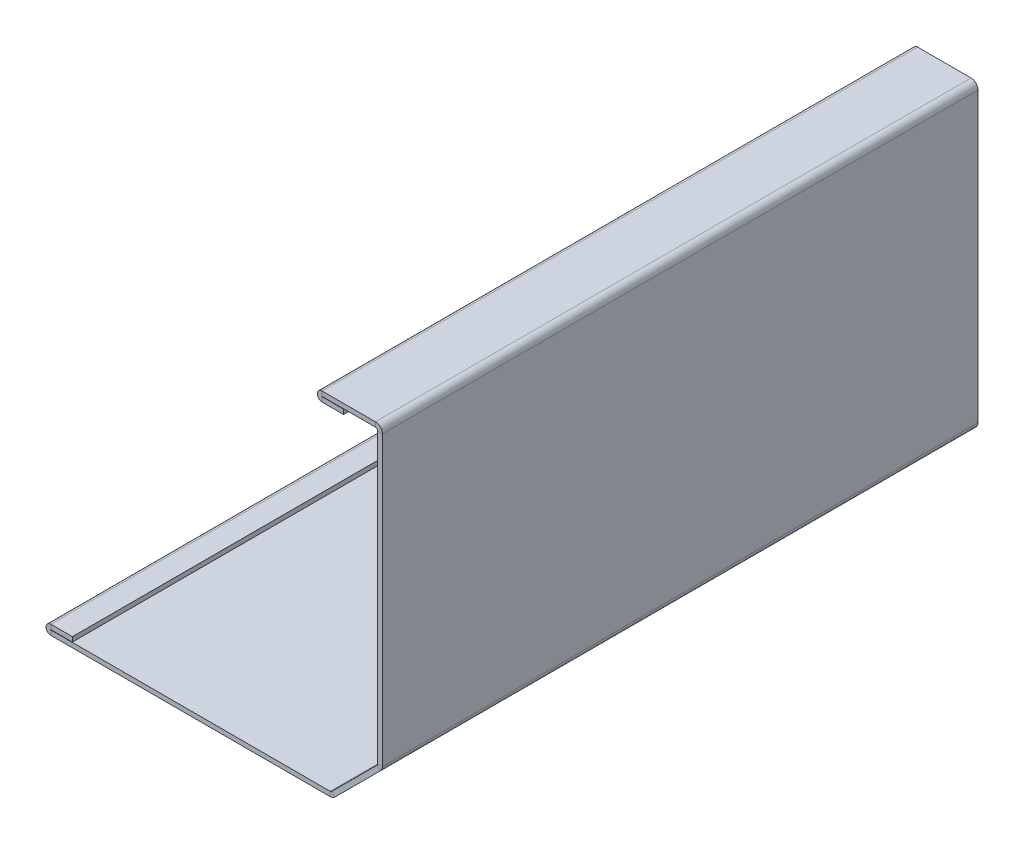
ISO-10303-21;
HEADER;
FILE_DESCRIPTION(('STEP AP214'),'2;1');
FILE_NAME('part.step','',(''),(''),'','','');
FILE_SCHEMA(('AUTOMOTIVE_DESIGN { 1 0 10303 214 1 1 1 1 }'));
ENDSEC;
DATA;
#1=APPLICATION_CONTEXT('core data for automotive mechanical design processes');
#2=APPLICATION_PROTOCOL_DEFINITION('international standard','automotive_design',2000,#1);
#3=PRODUCT_CONTEXT('',#1,'mechanical');
#4=PRODUCT('Part','Part','',(#3));
#5=PRODUCT_RELATED_PRODUCT_CATEGORY('part','',(#4));
#6=PRODUCT_DEFINITION_FORMATION('','',#4);
#7=PRODUCT_DEFINITION_CONTEXT('part definition',#1,'design');
#8=PRODUCT_DEFINITION('design','',#6,#7);
#9=PRODUCT_DEFINITION_SHAPE('','',#8);
#10=(LENGTH_UNIT() NAMED_UNIT(*) SI_UNIT(.MILLI.,.METRE.));
#11=(NAMED_UNIT(*) PLANE_ANGLE_UNIT() SI_UNIT($,.RADIAN.));
#12=(NAMED_UNIT(*) SI_UNIT($,.STERADIAN.) SOLID_ANGLE_UNIT());
#13=UNCERTAINTY_MEASURE_WITH_UNIT(LENGTH_MEASURE(1.E-05),#10,'distance_accuracy_value','');
#14=(GEOMETRIC_REPRESENTATION_CONTEXT(3) GLOBAL_UNCERTAINTY_ASSIGNED_CONTEXT((#13)) GLOBAL_UNIT_ASSIGNED_CONTEXT((#10,
#11,#12)) REPRESENTATION_CONTEXT('',''));
#15=CARTESIAN_POINT('',(0.,0.,0.));
#16=DIRECTION('',(0.,0.,1.));
#17=DIRECTION('',(1.,0.,0.));
#18=AXIS2_PLACEMENT_3D('',#15,#16,#17);
#19=CARTESIAN_POINT('',(-47.,-1.5,96.));
#20=DIRECTION('',(0.,0.,1.));
#21=DIRECTION('',(1.,0.,0.));
#22=AXIS2_PLACEMENT_3D('',#19,#20,#21);
#23=PLANE('',#22);
#24=DIRECTION('',(1.,0.,0.));
#25=VECTOR('',#24,1.);
#26=CARTESIAN_POINT('',(-47.,0.,96.));
#27=LINE('',#26,#25);
#28=CARTESIAN_POINT('',(-45.45,0.,96.));
#29=VERTEX_POINT('',#28);
#30=CARTESIAN_POINT('',(44.5735699463963,0.,96.));
#31=VERTEX_POINT('',#30);
#32=EDGE_CURVE('E103',#29,#31,#27,.T.);
#33=ORIENTED_EDGE('',*,*,#32,.F.);
#34=DIRECTION('',(0.,-1.,0.));
#35=VECTOR('',#34,1.);
#36=CARTESIAN_POINT('',(-45.45,0.,96.));
#37=LINE('',#36,#35);
#38=CARTESIAN_POINT('',(-45.45,-1.5,96.));
#39=VERTEX_POINT('',#38);
#40=EDGE_CURVE('E276',#29,#39,#37,.T.);
#41=ORIENTED_EDGE('',*,*,#40,.T.);
#42=DIRECTION('',(1.,0.,0.));
#43=VECTOR('',#42,1.);
#44=CARTESIAN_POINT('',(-47.,-1.5,96.));
#45=LINE('',#44,#43);
#46=CARTESIAN_POINT('',(44.5735699463963,-1.5,96.));
#47=VERTEX_POINT('',#46);
#48=EDGE_CURVE('E13',#39,#47,#45,.T.);
#49=ORIENTED_EDGE('',*,*,#48,.T.);
#50=DIRECTION('',(0.,-1.,0.));
#51=VECTOR('',#50,1.);
#52=CARTESIAN_POINT('',(44.5735699463963,0.,96.));
#53=LINE('',#52,#51);
#54=EDGE_CURVE('E300',#31,#47,#53,.T.);
#55=ORIENTED_EDGE('',*,*,#54,.F.);
#56=EDGE_LOOP('',(#33,#41,#49,#55));
#57=FACE_BOUND('',#56,.T.);
#58=ADVANCED_FACE('F99',(#57),#23,.T.);
#59=CARTESIAN_POINT('',(61.4393398282213,110.43933982822,-96.));
#60=DIRECTION('',(0.,0.,1.));
#61=DIRECTION('',(1.,0.,0.));
#62=AXIS2_PLACEMENT_3D('',#59,#60,#61);
#63=PLANE('',#62);
#64=DIRECTION('',(1.,0.,0.));
#65=VECTOR('',#64,1.);
#66=CARTESIAN_POINT('',(59.9393398282213,108.20273982822,-96.));
#67=LINE('',#66,#65);
#68=CARTESIAN_POINT('',(59.9393398282213,108.20273982822,-96.));
#69=VERTEX_POINT('',#68);
#70=CARTESIAN_POINT('',(61.4393398282213,108.20273982822,-96.));
#71=VERTEX_POINT('',#70);
#72=EDGE_CURVE('E390',#69,#71,#67,.T.);
#73=ORIENTED_EDGE('',*,*,#72,.T.);
#74=DIRECTION('',(0.,1.,0.));
#75=VECTOR('',#74,1.);
#76=CARTESIAN_POINT('',(61.4393398282201,-1.50000000000069,-96.));
#77=LINE('',#76,#75);
#78=CARTESIAN_POINT('',(61.4393398282203,15.3657698818238,-96.));
#79=VERTEX_POINT('',#78);
#80=EDGE_CURVE('E387',#79,#71,#77,.T.);
#81=ORIENTED_EDGE('',*,*,#80,.F.);
#82=DIRECTION('',(-1.,0.,0.));
#83=VECTOR('',#82,1.);
#84=CARTESIAN_POINT('',(59.9393398282202,15.3657698818238,-96.));
#85=LINE('',#84,#83);
#86=CARTESIAN_POINT('',(59.9393398282202,15.3657698818238,-96.));
#87=VERTEX_POINT('',#86);
#88=EDGE_CURVE('E376',#87,#79,#85,.F.);
#89=ORIENTED_EDGE('',*,*,#88,.F.);
#90=DIRECTION('',(0.,-1.,0.));
#91=VECTOR('',#90,1.);
#92=CARTESIAN_POINT('',(59.9393398282213,110.43933982822,-96.));
#93=LINE('',#92,#91);
#94=EDGE_CURVE('E382',#87,#69,#93,.F.);
#95=ORIENTED_EDGE('',*,*,#94,.T.);
#96=EDGE_LOOP('',(#73,#81,#89,#95));
#97=FACE_BOUND('',#96,.T.);
#98=ADVANCED_FACE('F619',(#97),#63,.F.);
#99=CARTESIAN_POINT('',(61.4393398282203,15.0606601717797,96.));
#100=DIRECTION('',(0.,0.,-1.));
#101=DIRECTION('',(-1.,0.,0.));
#102=AXIS2_PLACEMENT_3D('',#99,#100,#101);
#103=PLANE('',#102);
#104=DIRECTION('',(1.,0.,0.));
#105=VECTOR('',#104,1.);
#106=CARTESIAN_POINT('',(59.9393398282213,108.20273982822,96.));
#107=LINE('',#106,#105);
#108=CARTESIAN_POINT('',(59.9393398282213,108.20273982822,96.));
#109=VERTEX_POINT('',#108);
#110=CARTESIAN_POINT('',(61.4393398282213,108.20273982822,96.));
#111=VERTEX_POINT('',#110);
#112=EDGE_CURVE('E374',#109,#111,#107,.T.);
#113=ORIENTED_EDGE('',*,*,#112,.F.);
#114=DIRECTION('',(0.,1.,0.));
#115=VECTOR('',#114,1.);
#116=CARTESIAN_POINT('',(59.9393398282202,15.0606601717797,96.));
#117=LINE('',#116,#115);
#118=CARTESIAN_POINT('',(59.9393398282202,15.3657698818238,95.9999999999999));
#119=VERTEX_POINT('',#118);
#120=EDGE_CURVE('E385',#109,#119,#117,.F.);
#121=ORIENTED_EDGE('',*,*,#120,.T.);
#122=DIRECTION('',(-1.,0.,0.));
#123=VECTOR('',#122,1.);
#124=CARTESIAN_POINT('',(61.4393398282203,15.3657698818238,96.));
#125=LINE('',#124,#123);
#126=CARTESIAN_POINT('',(61.4393398282203,15.3657698818238,95.9999999999999));
#127=VERTEX_POINT('',#126);
#128=EDGE_CURVE('E370',#119,#127,#125,.F.);
#129=ORIENTED_EDGE('',*,*,#128,.T.);
#130=DIRECTION('',(0.,-1.,0.));
#131=VECTOR('',#130,1.);
#132=CARTESIAN_POINT('',(61.4393398282201,-1.50000000000069,96.));
#133=LINE('',#132,#131);
#134=EDGE_CURVE('E357',#111,#127,#133,.T.);
#135=ORIENTED_EDGE('',*,*,#134,.F.);
#136=EDGE_LOOP('',(#113,#121,#129,#135));
#137=FACE_BOUND('',#136,.T.);
#138=ADVANCED_FACE('F553',(#137),#103,.F.);
#139=CARTESIAN_POINT('',(61.4393398282201,-1.50000000000069,0.));
#140=DIRECTION('',(-1.,0.,0.));
#141=DIRECTION('',(0.,-1.,0.));
#142=AXIS2_PLACEMENT_3D('',#139,#140,#141);
#143=PLANE('',#142);
#144=DIRECTION('',(0.,0.,-1.));
#145=VECTOR('',#144,1.);
#146=CARTESIAN_POINT('',(61.4393398282213,108.20273982822,-96.));
#147=LINE('',#146,#145);
#148=EDGE_CURVE('E409',#71,#111,#147,.F.);
#149=ORIENTED_EDGE('',*,*,#148,.T.);
#150=ORIENTED_EDGE('',*,*,#134,.T.);
#151=DIRECTION('',(0.,0.,-1.));
#152=VECTOR('',#151,1.);
#153=CARTESIAN_POINT('',(61.4393398282203,15.3657698818238,96.));
#154=LINE('',#153,#152);
#155=EDGE_CURVE('E379',#79,#127,#154,.F.);
#156=ORIENTED_EDGE('',*,*,#155,.F.);
#157=ORIENTED_EDGE('',*,*,#80,.T.);
#158=EDGE_LOOP('',(#149,#150,#156,#157));
#159=FACE_BOUND('',#158,.T.);
#160=ADVANCED_FACE('F668',(#159),#143,.F.);
#161=CARTESIAN_POINT('',(59.9393398282201,-1.50000000000067,0.));
#162=DIRECTION('',(-1.,0.,0.));
#163=DIRECTION('',(0.,-1.,0.));
#164=AXIS2_PLACEMENT_3D('',#161,#162,#163);
#165=PLANE('',#164);
#166=ORIENTED_EDGE('',*,*,#120,.F.);
#167=DIRECTION('',(0.,0.,-1.));
#168=VECTOR('',#167,1.);
#169=CARTESIAN_POINT('',(59.9393398282213,108.20273982822,-96.));
#170=LINE('',#169,#168);
#171=EDGE_CURVE('E399',#69,#109,#170,.F.);
#172=ORIENTED_EDGE('',*,*,#171,.F.);
#173=ORIENTED_EDGE('',*,*,#94,.F.);
#174=DIRECTION('',(0.,0.,-1.));
#175=VECTOR('',#174,1.);
#176=CARTESIAN_POINT('',(59.9393398282202,15.3657698818238,96.));
#177=LINE('',#176,#175);
#178=EDGE_CURVE('E373',#119,#87,#177,.T.);
#179=ORIENTED_EDGE('',*,*,#178,.F.);
#180=EDGE_LOOP('',(#166,#172,#173,#179));
#181=FACE_BOUND('',#180,.T.);
#182=ADVANCED_FACE('F556',(#181),#165,.T.);
#183=CARTESIAN_POINT('',(45.9393398282202,-1.06066017177983,96.));
#184=DIRECTION('',(0.,0.,-1.));
#185=DIRECTION('',(-1.,0.,0.));
#186=AXIS2_PLACEMENT_3D('',#183,#184,#185);
#187=PLANE('',#186);
#188=DIRECTION('',(0.707106781186544,-0.707106781186551,0.));
#189=VECTOR('',#188,1.);
#190=CARTESIAN_POINT('',(59.7235946832423,14.8449150268018,95.9999999999999));
#191=LINE('',#190,#189);
#192=CARTESIAN_POINT('',(59.7235946832423,14.8449150268018,95.9999999999999));
#193=VERTEX_POINT('',#192);
#194=CARTESIAN_POINT('',(60.7842548550221,13.7842548550219,95.9999999999999));
#195=VERTEX_POINT('',#194);
#196=EDGE_CURVE('E331',#193,#195,#191,.T.);
#197=ORIENTED_EDGE('',*,*,#196,.F.);
#198=DIRECTION('',(0.707106781186551,0.707106781186544,0.));
#199=VECTOR('',#198,1.);
#200=CARTESIAN_POINT('',(44.8786796564403,0.,96.));
#201=LINE('',#200,#199);
#202=CARTESIAN_POINT('',(45.0944248014183,0.215745144977973,96.));
#203=VERTEX_POINT('',#202);
#204=EDGE_CURVE('E339',#193,#203,#201,.F.);
#205=ORIENTED_EDGE('',*,*,#204,.T.);
#206=DIRECTION('',(-0.707106781186544,0.707106781186551,0.));
#207=VECTOR('',#206,1.);
#208=CARTESIAN_POINT('',(46.1550849731981,-0.84491502680185,96.));
#209=LINE('',#208,#207);
#210=CARTESIAN_POINT('',(46.1550849731981,-0.844915026801848,96.));
#211=VERTEX_POINT('',#210);
#212=EDGE_CURVE('E327',#203,#211,#209,.F.);
#213=ORIENTED_EDGE('',*,*,#212,.T.);
#214=DIRECTION('',(-0.707106781186551,-0.707106781186544,0.));
#215=VECTOR('',#214,1.);
#216=CARTESIAN_POINT('',(22.4393398282199,-24.5606601717798,96.));
#217=LINE('',#216,#215);
#218=EDGE_CURVE('E344',#195,#211,#217,.T.);
#219=ORIENTED_EDGE('',*,*,#218,.F.);
#220=EDGE_LOOP('',(#197,#205,#213,#219));
#221=FACE_BOUND('',#220,.T.);
#222=ADVANCED_FACE('F537',(#221),#187,.F.);
#223=CARTESIAN_POINT('',(62.5000000000001,15.4999999999999,-96.));
#224=DIRECTION('',(0.,0.,1.));
#225=DIRECTION('',(1.,0.,0.));
#226=AXIS2_PLACEMENT_3D('',#223,#224,#225);
#227=PLANE('',#226);
#228=DIRECTION('',(0.707106781186544,-0.707106781186551,0.));
#229=VECTOR('',#228,1.);
#230=CARTESIAN_POINT('',(59.7235946832423,14.8449150268018,-96.));
#231=LINE('',#230,#229);
#232=CARTESIAN_POINT('',(59.7235946832423,14.8449150268018,-96.));
#233=VERTEX_POINT('',#232);
#234=CARTESIAN_POINT('',(60.7842548550221,13.7842548550219,-96.));
#235=VERTEX_POINT('',#234);
#236=EDGE_CURVE('E347',#233,#235,#231,.T.);
#237=ORIENTED_EDGE('',*,*,#236,.T.);
#238=DIRECTION('',(0.707106781186551,0.707106781186544,0.));
#239=VECTOR('',#238,1.);
#240=CARTESIAN_POINT('',(22.4393398282199,-24.5606601717798,-96.));
#241=LINE('',#240,#239);
#242=CARTESIAN_POINT('',(46.1550849731981,-0.844915026801867,-96.));
#243=VERTEX_POINT('',#242);
#244=EDGE_CURVE('E315',#243,#235,#241,.T.);
#245=ORIENTED_EDGE('',*,*,#244,.F.);
#246=DIRECTION('',(-0.707106781186544,0.707106781186551,0.));
#247=VECTOR('',#246,1.);
#248=CARTESIAN_POINT('',(45.0944248014183,0.215745144977963,-96.));
#249=LINE('',#248,#247);
#250=CARTESIAN_POINT('',(45.0944248014183,0.215745144977947,-96.));
#251=VERTEX_POINT('',#250);
#252=EDGE_CURVE('E333',#251,#243,#249,.F.);
#253=ORIENTED_EDGE('',*,*,#252,.F.);
#254=DIRECTION('',(-0.707106781186551,-0.707106781186544,0.));
#255=VECTOR('',#254,1.);
#256=CARTESIAN_POINT('',(61.4393398282203,16.5606601717797,-96.));
#257=LINE('',#256,#255);
#258=EDGE_CURVE('E341',#251,#233,#257,.F.);
#259=ORIENTED_EDGE('',*,*,#258,.T.);
#260=EDGE_LOOP('',(#237,#245,#253,#259));
#261=FACE_BOUND('',#260,.T.);
#262=ADVANCED_FACE('F644',(#261),#227,.F.);
#263=CARTESIAN_POINT('',(22.4393398282199,-24.5606601717798,0.));
#264=DIRECTION('',(-0.707106781186544,0.707106781186551,0.));
#265=DIRECTION('',(-0.707106781186551,-0.707106781186544,0.));
#266=AXIS2_PLACEMENT_3D('',#263,#264,#265);
#267=PLANE('',#266);
#268=DIRECTION('',(0.,0.,-1.));
#269=VECTOR('',#268,1.);
#270=CARTESIAN_POINT('',(60.7842548550221,13.7842548550219,-96.));
#271=LINE('',#270,#269);
#272=EDGE_CURVE('E366',#235,#195,#271,.F.);
#273=ORIENTED_EDGE('',*,*,#272,.T.);
#274=ORIENTED_EDGE('',*,*,#218,.T.);
#275=DIRECTION('',(0.,0.,-1.));
#276=VECTOR('',#275,1.);
#277=CARTESIAN_POINT('',(46.1550849731981,-0.844915026801853,96.));
#278=LINE('',#277,#276);
#279=EDGE_CURVE('E336',#243,#211,#278,.F.);
#280=ORIENTED_EDGE('',*,*,#279,.F.);
#281=ORIENTED_EDGE('',*,*,#244,.T.);
#282=EDGE_LOOP('',(#273,#274,#280,#281));
#283=FACE_BOUND('',#282,.T.);
#284=ADVANCED_FACE('F647',(#283),#267,.F.);
#285=CARTESIAN_POINT('',(21.3786796564401,-23.5,0.));
#286=DIRECTION('',(-0.707106781186544,0.707106781186551,0.));
#287=DIRECTION('',(-0.707106781186551,-0.707106781186544,0.));
#288=AXIS2_PLACEMENT_3D('',#285,#286,#287);
#289=PLANE('',#288);
#290=ORIENTED_EDGE('',*,*,#204,.F.);
#291=DIRECTION('',(0.,0.,-1.));
#292=VECTOR('',#291,1.);
#293=CARTESIAN_POINT('',(59.7235946832423,14.8449150268018,-96.));
#294=LINE('',#293,#292);
#295=EDGE_CURVE('E356',#233,#193,#294,.F.);
#296=ORIENTED_EDGE('',*,*,#295,.F.);
#297=ORIENTED_EDGE('',*,*,#258,.F.);
#298=DIRECTION('',(0.,0.,-1.));
#299=VECTOR('',#298,1.);
#300=CARTESIAN_POINT('',(45.0944248014183,0.215745144977977,96.));
#301=LINE('',#300,#299);
#302=EDGE_CURVE('E330',#203,#251,#301,.T.);
#303=ORIENTED_EDGE('',*,*,#302,.F.);
#304=EDGE_LOOP('',(#290,#296,#297,#303));
#305=FACE_BOUND('',#304,.T.);
#306=ADVANCED_FACE('F540',(#305),#289,.T.);
#307=CARTESIAN_POINT('',(-47.,-1.5,-96.));
#308=DIRECTION('',(0.,0.,-1.));
#309=DIRECTION('',(-1.,0.,0.));
#310=AXIS2_PLACEMENT_3D('',#307,#308,#309);
#311=PLANE('',#310);
#312=DIRECTION('',(0.,-1.,0.));
#313=VECTOR('',#312,1.);
#314=CARTESIAN_POINT('',(-45.45,0.,-96.));
#315=LINE('',#314,#313);
#316=CARTESIAN_POINT('',(-45.45,0.,-96.));
#317=VERTEX_POINT('',#316);
#318=CARTESIAN_POINT('',(-45.45,-1.5,-96.));
#319=VERTEX_POINT('',#318);
#320=EDGE_CURVE('E264',#317,#319,#315,.T.);
#321=ORIENTED_EDGE('',*,*,#320,.F.);
#322=DIRECTION('',(-1.,0.,0.));
#323=VECTOR('',#322,1.);
#324=CARTESIAN_POINT('',(-47.,0.,-96.));
#325=LINE('',#324,#323);
#326=CARTESIAN_POINT('',(44.5735699463963,0.,-96.));
#327=VERTEX_POINT('',#326);
#328=EDGE_CURVE('E297',#327,#317,#325,.T.);
#329=ORIENTED_EDGE('',*,*,#328,.F.);
#330=DIRECTION('',(0.,-1.,0.));
#331=VECTOR('',#330,1.);
#332=CARTESIAN_POINT('',(44.5735699463963,0.,-96.));
#333=LINE('',#332,#331);
#334=CARTESIAN_POINT('',(44.5735699463963,-1.50000000000004,-96.));
#335=VERTEX_POINT('',#334);
#336=EDGE_CURVE('E295',#327,#335,#333,.T.);
#337=ORIENTED_EDGE('',*,*,#336,.T.);
#338=DIRECTION('',(-1.,0.,0.));
#339=VECTOR('',#338,1.);
#340=CARTESIAN_POINT('',(-47.,-1.5,-96.));
#341=LINE('',#340,#339);
#342=EDGE_CURVE('E108',#335,#319,#341,.T.);
#343=ORIENTED_EDGE('',*,*,#342,.T.);
#344=EDGE_LOOP('',(#321,#329,#337,#343));
#345=FACE_BOUND('',#344,.T.);
#346=ADVANCED_FACE('F101',(#345),#311,.T.);
#347=CARTESIAN_POINT('',(0.,-1.5,0.));
#348=DIRECTION('',(0.,-1.,0.));
#349=DIRECTION('',(0.,0.,-1.));
#350=AXIS2_PLACEMENT_3D('',#347,#348,#349);
#351=PLANE('',#350);
#352=DIRECTION('',(0.,0.,1.));
#353=VECTOR('',#352,1.);
#354=CARTESIAN_POINT('',(-45.45,-1.5,96.));
#355=LINE('',#354,#353);
#356=EDGE_CURVE('E283',#39,#319,#355,.F.);
#357=ORIENTED_EDGE('',*,*,#356,.T.);
#358=ORIENTED_EDGE('',*,*,#342,.F.);
#359=DIRECTION('',(0.,0.,-1.));
#360=VECTOR('',#359,1.);
#361=CARTESIAN_POINT('',(44.5735699463963,-1.50000000000004,-96.));
#362=LINE('',#361,#360);
#363=EDGE_CURVE('E324',#335,#47,#362,.F.);
#364=ORIENTED_EDGE('',*,*,#363,.T.);
#365=ORIENTED_EDGE('',*,*,#48,.F.);
#366=EDGE_LOOP('',(#357,#358,#364,#365));
#367=FACE_BOUND('',#366,.T.);
#368=ADVANCED_FACE('F290',(#367),#351,.T.);
#369=CARTESIAN_POINT('',(0.,0.,0.));
#370=DIRECTION('',(0.,-1.,0.));
#371=DIRECTION('',(0.,0.,-1.));
#372=AXIS2_PLACEMENT_3D('',#369,#370,#371);
#373=PLANE('',#372);
#374=ORIENTED_EDGE('',*,*,#328,.T.);
#375=DIRECTION('',(0.,0.,1.));
#376=VECTOR('',#375,1.);
#377=CARTESIAN_POINT('',(-45.45,0.,96.));
#378=LINE('',#377,#376);
#379=EDGE_CURVE('E518',#29,#317,#378,.F.);
#380=ORIENTED_EDGE('',*,*,#379,.F.);
#381=ORIENTED_EDGE('',*,*,#32,.T.);
#382=DIRECTION('',(0.,0.,-1.));
#383=VECTOR('',#382,1.);
#384=CARTESIAN_POINT('',(44.5735699463963,0.,-96.));
#385=LINE('',#384,#383);
#386=EDGE_CURVE('E314',#327,#31,#385,.F.);
#387=ORIENTED_EDGE('',*,*,#386,.F.);
#388=EDGE_LOOP('',(#374,#380,#381,#387));
#389=FACE_BOUND('',#388,.T.);
#390=ADVANCED_FACE('F528',(#389),#373,.F.);
#391=CARTESIAN_POINT('',(44.5735699463963,0.736599999999988,96.));
#392=DIRECTION('',(0.,0.,1.));
#393=DIRECTION('',(0.,-1.,0.));
#394=AXIS2_PLACEMENT_3D('',#391,#392,#393);
#395=PLANE('',#394);
#396=ORIENTED_EDGE('',*,*,#212,.F.);
#397=CARTESIAN_POINT('',(44.5735699463963,0.736599999999988,96.));
#398=DIRECTION('',(0.,0.,-1.));
#399=DIRECTION('',(0.,1.,0.));
#400=AXIS2_PLACEMENT_3D('',#397,#398,#399);
#401=CIRCLE('',#400,0.736600000000002);
#402=EDGE_CURVE('E318',#31,#203,#401,.F.);
#403=ORIENTED_EDGE('',*,*,#402,.F.);
#404=ORIENTED_EDGE('',*,*,#54,.T.);
#405=CARTESIAN_POINT('',(44.5735699463963,0.736599999999988,96.));
#406=DIRECTION('',(0.,0.,-1.));
#407=DIRECTION('',(0.,1.,0.));
#408=AXIS2_PLACEMENT_3D('',#405,#406,#407);
#409=CIRCLE('',#408,2.2366);
#410=EDGE_CURVE('E309',#47,#211,#409,.F.);
#411=ORIENTED_EDGE('',*,*,#410,.T.);
#412=EDGE_LOOP('',(#396,#403,#404,#411));
#413=FACE_BOUND('',#412,.T.);
#414=ADVANCED_FACE('F534',(#413),#395,.T.);
#415=CARTESIAN_POINT('',(44.5735699463963,0.736599999999962,-96.));
#416=DIRECTION('',(0.,0.,1.));
#417=DIRECTION('',(0.,-1.,0.));
#418=AXIS2_PLACEMENT_3D('',#415,#416,#417);
#419=PLANE('',#418);
#420=CARTESIAN_POINT('',(44.5735699463963,0.736599999999962,-96.));
#421=DIRECTION('',(0.,0.,-1.));
#422=DIRECTION('',(0.,1.,0.));
#423=AXIS2_PLACEMENT_3D('',#420,#421,#422);
#424=CIRCLE('',#423,0.736600000000002);
#425=EDGE_CURVE('E311',#251,#327,#424,.T.);
#426=ORIENTED_EDGE('',*,*,#425,.F.);
#427=ORIENTED_EDGE('',*,*,#252,.T.);
#428=CARTESIAN_POINT('',(44.5735699463963,0.736599999999962,-96.));
#429=DIRECTION('',(0.,0.,-1.));
#430=DIRECTION('',(0.,1.,0.));
#431=AXIS2_PLACEMENT_3D('',#428,#429,#430);
#432=CIRCLE('',#431,2.2366);
#433=EDGE_CURVE('E321',#243,#335,#432,.T.);
#434=ORIENTED_EDGE('',*,*,#433,.T.);
#435=ORIENTED_EDGE('',*,*,#336,.F.);
#436=EDGE_LOOP('',(#426,#427,#434,#435));
#437=FACE_BOUND('',#436,.T.);
#438=ADVANCED_FACE('F630',(#437),#419,.F.);
#439=CARTESIAN_POINT('',(44.5735699463963,0.736599999999962,-96.));
#440=DIRECTION('',(0.,0.,-1.));
#441=DIRECTION('',(0.707106781186544,-0.707106781186551,0.));
#442=AXIS2_PLACEMENT_3D('',#439,#440,#441);
#443=CYLINDRICAL_SURFACE('',#442,2.2366);
#444=ORIENTED_EDGE('',*,*,#363,.F.);
#445=ORIENTED_EDGE('',*,*,#433,.F.);
#446=ORIENTED_EDGE('',*,*,#279,.T.);
#447=ORIENTED_EDGE('',*,*,#410,.F.);
#448=EDGE_LOOP('',(#444,#445,#446,#447));
#449=FACE_BOUND('',#448,.T.);
#450=ADVANCED_FACE('F633',(#449),#443,.T.);
#451=CARTESIAN_POINT('',(44.5735699463963,0.736599999999962,-96.));
#452=DIRECTION('',(0.,0.,-1.));
#453=DIRECTION('',(0.707106781186544,-0.707106781186551,0.));
#454=AXIS2_PLACEMENT_3D('',#451,#452,#453);
#455=CYLINDRICAL_SURFACE('',#454,0.736600000000002);
#456=ORIENTED_EDGE('',*,*,#386,.T.);
#457=ORIENTED_EDGE('',*,*,#402,.T.);
#458=ORIENTED_EDGE('',*,*,#302,.T.);
#459=ORIENTED_EDGE('',*,*,#425,.T.);
#460=EDGE_LOOP('',(#456,#457,#458,#459));
#461=FACE_BOUND('',#460,.T.);
#462=ADVANCED_FACE('F530',(#461),#455,.F.);
#463=CARTESIAN_POINT('',(59.2027398282203,15.3657698818238,95.9999999999999));
#464=DIRECTION('',(0.,0.,1.));
#465=DIRECTION('',(1.,0.,0.));
#466=AXIS2_PLACEMENT_3D('',#463,#464,#465);
#467=PLANE('',#466);
#468=ORIENTED_EDGE('',*,*,#128,.F.);
#469=CARTESIAN_POINT('',(59.2027398282203,15.3657698818238,95.9999999999999));
#470=DIRECTION('',(0.,0.,-1.));
#471=DIRECTION('',(-1.,0.,0.));
#472=AXIS2_PLACEMENT_3D('',#469,#470,#471);
#473=CIRCLE('',#472,0.736599999999997);
#474=EDGE_CURVE('E360',#193,#119,#473,.F.);
#475=ORIENTED_EDGE('',*,*,#474,.F.);
#476=ORIENTED_EDGE('',*,*,#196,.T.);
#477=CARTESIAN_POINT('',(59.2027398282203,15.3657698818238,95.9999999999999));
#478=DIRECTION('',(0.,0.,-1.));
#479=DIRECTION('',(-1.,0.,0.));
#480=AXIS2_PLACEMENT_3D('',#477,#478,#479);
#481=CIRCLE('',#480,2.2366);
#482=EDGE_CURVE('E350',#195,#127,#481,.F.);
#483=ORIENTED_EDGE('',*,*,#482,.T.);
#484=EDGE_LOOP('',(#468,#475,#476,#483));
#485=FACE_BOUND('',#484,.T.);
#486=ADVANCED_FACE('F549',(#485),#467,.T.);
#487=CARTESIAN_POINT('',(59.2027398282203,15.3657698818238,-96.));
#488=DIRECTION('',(0.,0.,1.));
#489=DIRECTION('',(1.,0.,0.));
#490=AXIS2_PLACEMENT_3D('',#487,#488,#489);
#491=PLANE('',#490);
#492=CARTESIAN_POINT('',(59.2027398282203,15.3657698818238,-96.));
#493=DIRECTION('',(0.,0.,-1.));
#494=DIRECTION('',(-1.,0.,0.));
#495=AXIS2_PLACEMENT_3D('',#492,#493,#494);
#496=CIRCLE('',#495,0.736599999999997);
#497=EDGE_CURVE('E353',#87,#233,#496,.T.);
#498=ORIENTED_EDGE('',*,*,#497,.F.);
#499=ORIENTED_EDGE('',*,*,#88,.T.);
#500=CARTESIAN_POINT('',(59.2027398282203,15.3657698818238,-96.));
#501=DIRECTION('',(0.,0.,-1.));
#502=DIRECTION('',(-1.,0.,0.));
#503=AXIS2_PLACEMENT_3D('',#500,#501,#502);
#504=CIRCLE('',#503,2.2366);
#505=EDGE_CURVE('E363',#79,#235,#504,.T.);
#506=ORIENTED_EDGE('',*,*,#505,.T.);
#507=ORIENTED_EDGE('',*,*,#236,.F.);
#508=EDGE_LOOP('',(#498,#499,#506,#507));
#509=FACE_BOUND('',#508,.T.);
#510=ADVANCED_FACE('F654',(#509),#491,.F.);
#511=CARTESIAN_POINT('',(59.2027398282203,15.3657698818238,-96.));
#512=DIRECTION('',(0.,0.,-1.));
#513=DIRECTION('',(1.,0.,0.));
#514=AXIS2_PLACEMENT_3D('',#511,#512,#513);
#515=CYLINDRICAL_SURFACE('',#514,2.2366);
#516=ORIENTED_EDGE('',*,*,#272,.F.);
#517=ORIENTED_EDGE('',*,*,#505,.F.);
#518=ORIENTED_EDGE('',*,*,#155,.T.);
#519=ORIENTED_EDGE('',*,*,#482,.F.);
#520=EDGE_LOOP('',(#516,#517,#518,#519));
#521=FACE_BOUND('',#520,.T.);
#522=ADVANCED_FACE('F657',(#521),#515,.T.);
#523=CARTESIAN_POINT('',(59.2027398282203,15.3657698818238,-96.));
#524=DIRECTION('',(0.,0.,-1.));
#525=DIRECTION('',(1.,0.,0.));
#526=AXIS2_PLACEMENT_3D('',#523,#524,#525);
#527=CYLINDRICAL_SURFACE('',#526,0.736599999999997);
#528=ORIENTED_EDGE('',*,*,#295,.T.);
#529=ORIENTED_EDGE('',*,*,#474,.T.);
#530=ORIENTED_EDGE('',*,*,#178,.T.);
#531=ORIENTED_EDGE('',*,*,#497,.T.);
#532=EDGE_LOOP('',(#528,#529,#530,#531));
#533=FACE_BOUND('',#532,.T.);
#534=ADVANCED_FACE('F544',(#533),#527,.F.);
#535=CARTESIAN_POINT('',(59.2027398282213,108.20273982822,96.));
#536=DIRECTION('',(0.,0.,1.));
#537=DIRECTION('',(1.,0.,0.));
#538=AXIS2_PLACEMENT_3D('',#535,#536,#537);
#539=PLANE('',#538);
#540=DIRECTION('',(0.,-1.,0.));
#541=VECTOR('',#540,1.);
#542=CARTESIAN_POINT('',(59.2027398282213,110.43933982822,96.));
#543=LINE('',#542,#541);
#544=CARTESIAN_POINT('',(59.2027398282213,108.93933982822,96.));
#545=VERTEX_POINT('',#544);
#546=CARTESIAN_POINT('',(59.2027398282213,110.43933982822,96.));
#547=VERTEX_POINT('',#546);
#548=EDGE_CURVE('E413',#545,#547,#543,.F.);
#549=ORIENTED_EDGE('',*,*,#548,.F.);
#550=CARTESIAN_POINT('',(59.2027398282213,108.20273982822,96.));
#551=DIRECTION('',(0.,0.,-1.));
#552=DIRECTION('',(-1.,0.,0.));
#553=AXIS2_PLACEMENT_3D('',#550,#551,#552);
#554=CIRCLE('',#553,0.73659999999999);
#555=EDGE_CURVE('E403',#109,#545,#554,.F.);
#556=ORIENTED_EDGE('',*,*,#555,.F.);
#557=ORIENTED_EDGE('',*,*,#112,.T.);
#558=CARTESIAN_POINT('',(59.2027398282213,108.20273982822,96.));
#559=DIRECTION('',(0.,0.,-1.));
#560=DIRECTION('',(-1.,0.,0.));
#561=AXIS2_PLACEMENT_3D('',#558,#559,#560);
#562=CIRCLE('',#561,2.23659999999999);
#563=EDGE_CURVE('E393',#111,#547,#562,.F.);
#564=ORIENTED_EDGE('',*,*,#563,.T.);
#565=EDGE_LOOP('',(#549,#556,#557,#564));
#566=FACE_BOUND('',#565,.T.);
#567=ADVANCED_FACE('F565',(#566),#539,.T.);
#568=CARTESIAN_POINT('',(59.2027398282213,108.20273982822,-96.));
#569=DIRECTION('',(0.,0.,1.));
#570=DIRECTION('',(1.,0.,0.));
#571=AXIS2_PLACEMENT_3D('',#568,#569,#570);
#572=PLANE('',#571);
#573=CARTESIAN_POINT('',(59.2027398282213,108.20273982822,-96.));
#574=DIRECTION('',(0.,0.,-1.));
#575=DIRECTION('',(-1.,0.,0.));
#576=AXIS2_PLACEMENT_3D('',#573,#574,#575);
#577=CIRCLE('',#576,0.73659999999999);
#578=CARTESIAN_POINT('',(59.2027398282213,108.93933982822,-96.));
#579=VERTEX_POINT('',#578);
#580=EDGE_CURVE('E396',#579,#69,#577,.T.);
#581=ORIENTED_EDGE('',*,*,#580,.F.);
#582=DIRECTION('',(0.,-1.,0.));
#583=VECTOR('',#582,1.);
#584=CARTESIAN_POINT('',(59.2027398282213,108.93933982822,-96.));
#585=LINE('',#584,#583);
#586=CARTESIAN_POINT('',(59.2027398282213,110.43933982822,-96.));
#587=VERTEX_POINT('',#586);
#588=EDGE_CURVE('E419',#579,#587,#585,.F.);
#589=ORIENTED_EDGE('',*,*,#588,.T.);
#590=CARTESIAN_POINT('',(59.2027398282213,108.20273982822,-96.));
#591=DIRECTION('',(0.,0.,-1.));
#592=DIRECTION('',(-1.,0.,0.));
#593=AXIS2_PLACEMENT_3D('',#590,#591,#592);
#594=CIRCLE('',#593,2.23659999999999);
#595=EDGE_CURVE('E406',#587,#71,#594,.T.);
#596=ORIENTED_EDGE('',*,*,#595,.T.);
#597=ORIENTED_EDGE('',*,*,#72,.F.);
#598=EDGE_LOOP('',(#581,#589,#596,#597));
#599=FACE_BOUND('',#598,.T.);
#600=ADVANCED_FACE('F574',(#599),#572,.F.);
#601=CARTESIAN_POINT('',(59.2027398282213,108.20273982822,-96.));
#602=DIRECTION('',(0.,0.,-1.));
#603=DIRECTION('',(0.,1.,0.));
#604=AXIS2_PLACEMENT_3D('',#601,#602,#603);
#605=CYLINDRICAL_SURFACE('',#604,2.23659999999999);
#606=ORIENTED_EDGE('',*,*,#148,.F.);
#607=ORIENTED_EDGE('',*,*,#595,.F.);
#608=DIRECTION('',(0.,0.,-1.));
#609=VECTOR('',#608,1.);
#610=CARTESIAN_POINT('',(59.2027398282213,110.43933982822,96.));
#611=LINE('',#610,#609);
#612=EDGE_CURVE('E422',#587,#547,#611,.F.);
#613=ORIENTED_EDGE('',*,*,#612,.T.);
#614=ORIENTED_EDGE('',*,*,#563,.F.);
#615=EDGE_LOOP('',(#606,#607,#613,#614));
#616=FACE_BOUND('',#615,.T.);
#617=ADVANCED_FACE('F676',(#616),#605,.T.);
#618=CARTESIAN_POINT('',(59.2027398282213,108.20273982822,-96.));
#619=DIRECTION('',(0.,0.,-1.));
#620=DIRECTION('',(0.,1.,0.));
#621=AXIS2_PLACEMENT_3D('',#618,#619,#620);
#622=CYLINDRICAL_SURFACE('',#621,0.73659999999999);
#623=ORIENTED_EDGE('',*,*,#171,.T.);
#624=ORIENTED_EDGE('',*,*,#555,.T.);
#625=DIRECTION('',(0.,0.,-1.));
#626=VECTOR('',#625,1.);
#627=CARTESIAN_POINT('',(59.2027398282213,108.93933982822,96.));
#628=LINE('',#627,#626);
#629=EDGE_CURVE('E416',#545,#579,#628,.T.);
#630=ORIENTED_EDGE('',*,*,#629,.T.);
#631=ORIENTED_EDGE('',*,*,#580,.T.);
#632=EDGE_LOOP('',(#623,#624,#630,#631));
#633=FACE_BOUND('',#632,.T.);
#634=ADVANCED_FACE('F560',(#633),#622,.F.);
#635=CARTESIAN_POINT('',(40.4393398282213,110.43933982822,-96.));
#636=DIRECTION('',(0.,0.,1.));
#637=DIRECTION('',(1.,0.,0.));
#638=AXIS2_PLACEMENT_3D('',#635,#636,#637);
#639=PLANE('',#638);
#640=DIRECTION('',(1.,0.,0.));
#641=VECTOR('',#640,1.);
#642=CARTESIAN_POINT('',(40.4393398282213,108.93933982822,-96.));
#643=LINE('',#642,#641);
#644=CARTESIAN_POINT('',(41.9893398282213,108.93933982822,-96.));
#645=VERTEX_POINT('',#644);
#646=EDGE_CURVE('E425',#579,#645,#643,.F.);
#647=ORIENTED_EDGE('',*,*,#646,.T.);
#648=DIRECTION('',(0.,1.,0.));
#649=VECTOR('',#648,1.);
#650=CARTESIAN_POINT('',(41.9893398282213,108.93933982822,-96.));
#651=LINE('',#650,#649);
#652=CARTESIAN_POINT('',(41.9893398282213,110.43933982822,-96.));
#653=VERTEX_POINT('',#652);
#654=EDGE_CURVE('E116',#645,#653,#651,.T.);
#655=ORIENTED_EDGE('',*,*,#654,.T.);
#656=DIRECTION('',(-1.,0.,0.));
#657=VECTOR('',#656,1.);
#658=CARTESIAN_POINT('',(1.57718975920946E-12,110.439339828221,-96.));
#659=LINE('',#658,#657);
#660=EDGE_CURVE('E429',#587,#653,#659,.T.);
#661=ORIENTED_EDGE('',*,*,#660,.F.);
#662=ORIENTED_EDGE('',*,*,#588,.F.);
#663=EDGE_LOOP('',(#647,#655,#661,#662));
#664=FACE_BOUND('',#663,.T.);
#665=ADVANCED_FACE('F576',(#664),#639,.F.);
#666=CARTESIAN_POINT('',(59.9393398282213,110.43933982822,96.));
#667=DIRECTION('',(0.,0.,-1.));
#668=DIRECTION('',(-1.,0.,0.));
#669=AXIS2_PLACEMENT_3D('',#666,#667,#668);
#670=PLANE('',#669);
#671=DIRECTION('',(1.,0.,0.));
#672=VECTOR('',#671,1.);
#673=CARTESIAN_POINT('',(1.57718975920946E-12,110.439339828221,96.));
#674=LINE('',#673,#672);
#675=CARTESIAN_POINT('',(41.9893398282213,110.43933982822,96.));
#676=VERTEX_POINT('',#675);
#677=EDGE_CURVE('E400',#676,#547,#674,.T.);
#678=ORIENTED_EDGE('',*,*,#677,.F.);
#679=DIRECTION('',(0.,1.,0.));
#680=VECTOR('',#679,1.);
#681=CARTESIAN_POINT('',(41.9893398282213,108.93933982822,96.));
#682=LINE('',#681,#680);
#683=CARTESIAN_POINT('',(41.9893398282213,108.93933982822,96.));
#684=VERTEX_POINT('',#683);
#685=EDGE_CURVE('E446',#684,#676,#682,.T.);
#686=ORIENTED_EDGE('',*,*,#685,.F.);
#687=DIRECTION('',(-1.,0.,0.));
#688=VECTOR('',#687,1.);
#689=CARTESIAN_POINT('',(59.9393398282213,108.93933982822,96.));
#690=LINE('',#689,#688);
#691=EDGE_CURVE('E427',#684,#545,#690,.F.);
#692=ORIENTED_EDGE('',*,*,#691,.T.);
#693=ORIENTED_EDGE('',*,*,#548,.T.);
#694=EDGE_LOOP('',(#678,#686,#692,#693));
#695=FACE_BOUND('',#694,.T.);
#696=ADVANCED_FACE('F568',(#695),#670,.F.);
#697=CARTESIAN_POINT('',(1.57718975920946E-12,110.439339828221,0.));
#698=DIRECTION('',(0.,-1.,0.));
#699=DIRECTION('',(1.,0.,0.));
#700=AXIS2_PLACEMENT_3D('',#697,#698,#699);
#701=PLANE('',#700);
#702=ORIENTED_EDGE('',*,*,#660,.T.);
#703=DIRECTION('',(0.,0.,-1.));
#704=VECTOR('',#703,1.);
#705=CARTESIAN_POINT('',(41.9893398282213,110.43933982822,-96.));
#706=LINE('',#705,#704);
#707=EDGE_CURVE('E480',#653,#676,#706,.F.);
#708=ORIENTED_EDGE('',*,*,#707,.T.);
#709=ORIENTED_EDGE('',*,*,#677,.T.);
#710=ORIENTED_EDGE('',*,*,#612,.F.);
#711=EDGE_LOOP('',(#702,#708,#709,#710));
#712=FACE_BOUND('',#711,.T.);
#713=ADVANCED_FACE('F579',(#712),#701,.F.);
#714=CARTESIAN_POINT('',(1.55558356319146E-12,108.939339828221,0.));
#715=DIRECTION('',(0.,-1.,0.));
#716=DIRECTION('',(1.,0.,0.));
#717=AXIS2_PLACEMENT_3D('',#714,#715,#716);
#718=PLANE('',#717);
#719=DIRECTION('',(0.,0.,-1.));
#720=VECTOR('',#719,1.);
#721=CARTESIAN_POINT('',(41.9893398282213,108.93933982822,-96.));
#722=LINE('',#721,#720);
#723=EDGE_CURVE('E124',#645,#684,#722,.F.);
#724=ORIENTED_EDGE('',*,*,#723,.F.);
#725=ORIENTED_EDGE('',*,*,#646,.F.);
#726=ORIENTED_EDGE('',*,*,#629,.F.);
#727=ORIENTED_EDGE('',*,*,#691,.F.);
#728=EDGE_LOOP('',(#724,#725,#726,#727));
#729=FACE_BOUND('',#728,.T.);
#730=ADVANCED_FACE('F570',(#729),#718,.T.);
#731=CARTESIAN_POINT('',(45.4643398282213,107.33933982822,-96.));
#732=DIRECTION('',(0.,0.,1.));
#733=DIRECTION('',(-1.,0.,0.));
#734=AXIS2_PLACEMENT_3D('',#731,#732,#733);
#735=PLANE('',#734);
#736=DIRECTION('',(0.,-1.,0.));
#737=VECTOR('',#736,1.);
#738=CARTESIAN_POINT('',(41.9893398282213,107.33933982822,-96.));
#739=LINE('',#738,#737);
#740=CARTESIAN_POINT('',(41.9893398282213,108.83933982822,-96.));
#741=VERTEX_POINT('',#740);
#742=CARTESIAN_POINT('',(41.9893398282213,107.33933982822,-96.));
#743=VERTEX_POINT('',#742);
#744=EDGE_CURVE('E438',#741,#743,#739,.T.);
#745=ORIENTED_EDGE('',*,*,#744,.F.);
#746=DIRECTION('',(1.,0.,0.));
#747=VECTOR('',#746,1.);
#748=CARTESIAN_POINT('',(45.4643398282213,108.83933982822,-96.));
#749=LINE('',#748,#747);
#750=CARTESIAN_POINT('',(48.9393398282213,108.83933982822,-96.));
#751=VERTEX_POINT('',#750);
#752=EDGE_CURVE('E448',#751,#741,#749,.F.);
#753=ORIENTED_EDGE('',*,*,#752,.F.);
#754=DIRECTION('',(0.,-1.,0.));
#755=VECTOR('',#754,1.);
#756=CARTESIAN_POINT('',(48.9393398282213,107.33933982822,-96.));
#757=LINE('',#756,#755);
#758=CARTESIAN_POINT('',(48.9393398282213,107.33933982822,-96.));
#759=VERTEX_POINT('',#758);
#760=EDGE_CURVE('E434',#751,#759,#757,.T.);
#761=ORIENTED_EDGE('',*,*,#760,.T.);
#762=DIRECTION('',(-1.,0.,0.));
#763=VECTOR('',#762,1.);
#764=CARTESIAN_POINT('',(45.4643398282213,107.33933982822,-96.));
#765=LINE('',#764,#763);
#766=EDGE_CURVE('E460',#759,#743,#765,.T.);
#767=ORIENTED_EDGE('',*,*,#766,.T.);
#768=EDGE_LOOP('',(#745,#753,#761,#767));
#769=FACE_BOUND('',#768,.T.);
#770=ADVANCED_FACE('F589',(#769),#735,.F.);
#771=CARTESIAN_POINT('',(48.9393398282213,107.33933982822,0.));
#772=DIRECTION('',(-1.,0.,0.));
#773=DIRECTION('',(0.,0.,-1.));
#774=AXIS2_PLACEMENT_3D('',#771,#772,#773);
#775=PLANE('',#774);
#776=ORIENTED_EDGE('',*,*,#760,.F.);
#777=DIRECTION('',(0.,0.,1.));
#778=VECTOR('',#777,1.);
#779=CARTESIAN_POINT('',(48.9393398282213,108.83933982822,0.));
#780=LINE('',#779,#778);
#781=CARTESIAN_POINT('',(48.9393398282213,108.83933982822,96.));
#782=VERTEX_POINT('',#781);
#783=EDGE_CURVE('E451',#782,#751,#780,.F.);
#784=ORIENTED_EDGE('',*,*,#783,.F.);
#785=DIRECTION('',(0.,-1.,0.));
#786=VECTOR('',#785,1.);
#787=CARTESIAN_POINT('',(48.9393398282213,107.33933982822,96.));
#788=LINE('',#787,#786);
#789=CARTESIAN_POINT('',(48.9393398282213,107.33933982822,96.));
#790=VERTEX_POINT('',#789);
#791=EDGE_CURVE('E432',#782,#790,#788,.T.);
#792=ORIENTED_EDGE('',*,*,#791,.T.);
#793=DIRECTION('',(0.,0.,-1.));
#794=VECTOR('',#793,1.);
#795=CARTESIAN_POINT('',(48.9393398282213,107.33933982822,0.));
#796=LINE('',#795,#794);
#797=EDGE_CURVE('E435',#790,#759,#796,.T.);
#798=ORIENTED_EDGE('',*,*,#797,.T.);
#799=EDGE_LOOP('',(#776,#784,#792,#798));
#800=FACE_BOUND('',#799,.T.);
#801=ADVANCED_FACE('F608',(#800),#775,.F.);
#802=CARTESIAN_POINT('',(45.4643398282213,107.33933982822,96.));
#803=DIRECTION('',(0.,0.,-1.));
#804=DIRECTION('',(1.,0.,0.));
#805=AXIS2_PLACEMENT_3D('',#802,#803,#804);
#806=PLANE('',#805);
#807=DIRECTION('',(1.,0.,0.));
#808=VECTOR('',#807,1.);
#809=CARTESIAN_POINT('',(45.4643398282213,108.83933982822,96.));
#810=LINE('',#809,#808);
#811=CARTESIAN_POINT('',(41.9893398282213,108.83933982822,96.));
#812=VERTEX_POINT('',#811);
#813=EDGE_CURVE('E442',#812,#782,#810,.T.);
#814=ORIENTED_EDGE('',*,*,#813,.F.);
#815=DIRECTION('',(0.,-1.,0.));
#816=VECTOR('',#815,1.);
#817=CARTESIAN_POINT('',(41.9893398282213,107.33933982822,96.));
#818=LINE('',#817,#816);
#819=CARTESIAN_POINT('',(41.9893398282213,107.33933982822,96.));
#820=VERTEX_POINT('',#819);
#821=EDGE_CURVE('E417',#812,#820,#818,.T.);
#822=ORIENTED_EDGE('',*,*,#821,.T.);
#823=DIRECTION('',(1.,0.,0.));
#824=VECTOR('',#823,1.);
#825=CARTESIAN_POINT('',(45.4643398282213,107.33933982822,96.));
#826=LINE('',#825,#824);
#827=EDGE_CURVE('E454',#820,#790,#826,.T.);
#828=ORIENTED_EDGE('',*,*,#827,.T.);
#829=ORIENTED_EDGE('',*,*,#791,.F.);
#830=EDGE_LOOP('',(#814,#822,#828,#829));
#831=FACE_BOUND('',#830,.T.);
#832=ADVANCED_FACE('F603',(#831),#806,.F.);
#833=CARTESIAN_POINT('',(45.4643398282213,107.33933982822,0.));
#834=DIRECTION('',(0.,-1.,0.));
#835=DIRECTION('',(1.,0.,0.));
#836=AXIS2_PLACEMENT_3D('',#833,#834,#835);
#837=PLANE('',#836);
#838=ORIENTED_EDGE('',*,*,#797,.F.);
#839=ORIENTED_EDGE('',*,*,#827,.F.);
#840=DIRECTION('',(0.,0.,1.));
#841=VECTOR('',#840,1.);
#842=CARTESIAN_POINT('',(41.9893398282213,107.33933982822,0.));
#843=LINE('',#842,#841);
#844=EDGE_CURVE('E457',#743,#820,#843,.T.);
#845=ORIENTED_EDGE('',*,*,#844,.F.);
#846=ORIENTED_EDGE('',*,*,#766,.F.);
#847=EDGE_LOOP('',(#838,#839,#845,#846));
#848=FACE_BOUND('',#847,.T.);
#849=ADVANCED_FACE('F606',(#848),#837,.T.);
#850=CARTESIAN_POINT('',(45.4643398282213,108.83933982822,0.));
#851=DIRECTION('',(0.,-1.,0.));
#852=DIRECTION('',(1.,0.,0.));
#853=AXIS2_PLACEMENT_3D('',#850,#851,#852);
#854=PLANE('',#853);
#855=ORIENTED_EDGE('',*,*,#783,.T.);
#856=ORIENTED_EDGE('',*,*,#752,.T.);
#857=DIRECTION('',(0.,0.,1.));
#858=VECTOR('',#857,1.);
#859=CARTESIAN_POINT('',(41.9893398282213,108.83933982822,0.));
#860=LINE('',#859,#858);
#861=EDGE_CURVE('E445',#741,#812,#860,.T.);
#862=ORIENTED_EDGE('',*,*,#861,.T.);
#863=ORIENTED_EDGE('',*,*,#813,.T.);
#864=EDGE_LOOP('',(#855,#856,#862,#863));
#865=FACE_BOUND('',#864,.T.);
#866=ADVANCED_FACE('F593',(#865),#854,.F.);
#867=CARTESIAN_POINT('',(41.9893398282213,108.88933982822,96.));
#868=DIRECTION('',(0.,0.,1.));
#869=DIRECTION('',(1.,0.,0.));
#870=AXIS2_PLACEMENT_3D('',#867,#868,#869);
#871=PLANE('',#870);
#872=ORIENTED_EDGE('',*,*,#821,.F.);
#873=CARTESIAN_POINT('',(41.9893398282213,108.88933982822,96.));
#874=DIRECTION('',(0.,0.,-1.));
#875=DIRECTION('',(-1.,0.,0.));
#876=AXIS2_PLACEMENT_3D('',#873,#874,#875);
#877=CIRCLE('',#876,0.0500000000000084);
#878=EDGE_CURVE('E474',#684,#812,#877,.F.);
#879=ORIENTED_EDGE('',*,*,#878,.F.);
#880=ORIENTED_EDGE('',*,*,#685,.T.);
#881=CARTESIAN_POINT('',(41.9893398282213,108.88933982822,96.));
#882=DIRECTION('',(0.,0.,-1.));
#883=DIRECTION('',(-1.,0.,0.));
#884=AXIS2_PLACEMENT_3D('',#881,#882,#883);
#885=CIRCLE('',#884,1.55000000000001);
#886=EDGE_CURVE('E466',#676,#820,#885,.F.);
#887=ORIENTED_EDGE('',*,*,#886,.T.);
#888=EDGE_LOOP('',(#872,#879,#880,#887));
#889=FACE_BOUND('',#888,.T.);
#890=ADVANCED_FACE('F601',(#889),#871,.T.);
#891=CARTESIAN_POINT('',(41.9893398282213,108.88933982822,-96.));
#892=DIRECTION('',(0.,0.,1.));
#893=DIRECTION('',(1.,0.,0.));
#894=AXIS2_PLACEMENT_3D('',#891,#892,#893);
#895=PLANE('',#894);
#896=CARTESIAN_POINT('',(41.9893398282213,108.88933982822,-96.));
#897=DIRECTION('',(0.,0.,-1.));
#898=DIRECTION('',(-1.,0.,0.));
#899=AXIS2_PLACEMENT_3D('',#896,#897,#898);
#900=CIRCLE('',#899,0.0500000000000084);
#901=EDGE_CURVE('E469',#741,#645,#900,.T.);
#902=ORIENTED_EDGE('',*,*,#901,.F.);
#903=ORIENTED_EDGE('',*,*,#744,.T.);
#904=CARTESIAN_POINT('',(41.9893398282213,108.88933982822,-96.));
#905=DIRECTION('',(0.,0.,-1.));
#906=DIRECTION('',(-1.,0.,0.));
#907=AXIS2_PLACEMENT_3D('',#904,#905,#906);
#908=CIRCLE('',#907,1.55000000000001);
#909=EDGE_CURVE('E477',#743,#653,#908,.T.);
#910=ORIENTED_EDGE('',*,*,#909,.T.);
#911=ORIENTED_EDGE('',*,*,#654,.F.);
#912=EDGE_LOOP('',(#902,#903,#910,#911));
#913=FACE_BOUND('',#912,.T.);
#914=ADVANCED_FACE('F586',(#913),#895,.F.);
#915=CARTESIAN_POINT('',(41.9893398282213,108.88933982822,-96.));
#916=DIRECTION('',(0.,0.,-1.));
#917=DIRECTION('',(0.,-1.,0.));
#918=AXIS2_PLACEMENT_3D('',#915,#916,#917);
#919=CYLINDRICAL_SURFACE('',#918,1.55000000000001);
#920=ORIENTED_EDGE('',*,*,#707,.F.);
#921=ORIENTED_EDGE('',*,*,#909,.F.);
#922=ORIENTED_EDGE('',*,*,#844,.T.);
#923=ORIENTED_EDGE('',*,*,#886,.F.);
#924=EDGE_LOOP('',(#920,#921,#922,#923));
#925=FACE_BOUND('',#924,.T.);
#926=ADVANCED_FACE('F583',(#925),#919,.T.);
#927=CARTESIAN_POINT('',(41.9893398282213,108.88933982822,-96.));
#928=DIRECTION('',(0.,0.,-1.));
#929=DIRECTION('',(0.,-1.,0.));
#930=AXIS2_PLACEMENT_3D('',#927,#928,#929);
#931=CYLINDRICAL_SURFACE('',#930,0.0500000000000084);
#932=ORIENTED_EDGE('',*,*,#723,.T.);
#933=ORIENTED_EDGE('',*,*,#878,.T.);
#934=ORIENTED_EDGE('',*,*,#861,.F.);
#935=ORIENTED_EDGE('',*,*,#901,.T.);
#936=EDGE_LOOP('',(#932,#933,#934,#935));
#937=FACE_BOUND('',#936,.T.);
#938=ADVANCED_FACE('F597',(#937),#931,.F.);
#939=CARTESIAN_POINT('',(-41.975,1.6,96.));
#940=DIRECTION('',(0.,0.,-1.));
#941=DIRECTION('',(-1.,0.,0.));
#942=AXIS2_PLACEMENT_3D('',#939,#940,#941);
#943=PLANE('',#942);
#944=DIRECTION('',(0.,1.,0.));
#945=VECTOR('',#944,1.);
#946=CARTESIAN_POINT('',(-45.45,1.6,96.));
#947=LINE('',#946,#945);
#948=CARTESIAN_POINT('',(-45.45,0.1,96.));
#949=VERTEX_POINT('',#948);
#950=CARTESIAN_POINT('',(-45.45,1.6,96.));
#951=VERTEX_POINT('',#950);
#952=EDGE_CURVE('E491',#949,#951,#947,.T.);
#953=ORIENTED_EDGE('',*,*,#952,.F.);
#954=DIRECTION('',(1.,0.,0.));
#955=VECTOR('',#954,1.);
#956=CARTESIAN_POINT('',(-41.975,0.1,96.));
#957=LINE('',#956,#955);
#958=CARTESIAN_POINT('',(-38.5,0.1,96.));
#959=VERTEX_POINT('',#958);
#960=EDGE_CURVE('E499',#959,#949,#957,.F.);
#961=ORIENTED_EDGE('',*,*,#960,.F.);
#962=DIRECTION('',(0.,1.,0.));
#963=VECTOR('',#962,1.);
#964=CARTESIAN_POINT('',(-38.5,1.6,96.));
#965=LINE('',#964,#963);
#966=CARTESIAN_POINT('',(-38.5,1.6,96.));
#967=VERTEX_POINT('',#966);
#968=EDGE_CURVE('E487',#959,#967,#965,.T.);
#969=ORIENTED_EDGE('',*,*,#968,.T.);
#970=DIRECTION('',(-1.,0.,0.));
#971=VECTOR('',#970,1.);
#972=CARTESIAN_POINT('',(-41.975,1.6,96.));
#973=LINE('',#972,#971);
#974=EDGE_CURVE('E509',#967,#951,#973,.T.);
#975=ORIENTED_EDGE('',*,*,#974,.T.);
#976=EDGE_LOOP('',(#953,#961,#969,#975));
#977=FACE_BOUND('',#976,.T.);
#978=ADVANCED_FACE('F770',(#977),#943,.F.);
#979=CARTESIAN_POINT('',(-38.5,1.6,0.));
#980=DIRECTION('',(-1.,0.,0.));
#981=DIRECTION('',(0.,0.,1.));
#982=AXIS2_PLACEMENT_3D('',#979,#980,#981);
#983=PLANE('',#982);
#984=ORIENTED_EDGE('',*,*,#968,.F.);
#985=DIRECTION('',(0.,0.,1.));
#986=VECTOR('',#985,1.);
#987=CARTESIAN_POINT('',(-38.5,0.1,0.));
#988=LINE('',#987,#986);
#989=CARTESIAN_POINT('',(-38.5,0.1,-96.));
#990=VERTEX_POINT('',#989);
#991=EDGE_CURVE('E502',#990,#959,#988,.T.);
#992=ORIENTED_EDGE('',*,*,#991,.F.);
#993=DIRECTION('',(0.,1.,0.));
#994=VECTOR('',#993,1.);
#995=CARTESIAN_POINT('',(-38.5,1.6,-96.));
#996=LINE('',#995,#994);
#997=CARTESIAN_POINT('',(-38.5,1.6,-96.));
#998=VERTEX_POINT('',#997);
#999=EDGE_CURVE('E485',#990,#998,#996,.T.);
#1000=ORIENTED_EDGE('',*,*,#999,.T.);
#1001=DIRECTION('',(0.,0.,1.));
#1002=VECTOR('',#1001,1.);
#1003=CARTESIAN_POINT('',(-38.5,1.6,0.));
#1004=LINE('',#1003,#1002);
#1005=EDGE_CURVE('E488',#998,#967,#1004,.T.);
#1006=ORIENTED_EDGE('',*,*,#1005,.T.);
#1007=EDGE_LOOP('',(#984,#992,#1000,#1006));
#1008=FACE_BOUND('',#1007,.T.);
#1009=ADVANCED_FACE('F780',(#1008),#983,.F.);
#1010=CARTESIAN_POINT('',(-41.975,1.6,-96.));
#1011=DIRECTION('',(0.,0.,1.));
#1012=DIRECTION('',(1.,0.,0.));
#1013=AXIS2_PLACEMENT_3D('',#1010,#1011,#1012);
#1014=PLANE('',#1013);
#1015=DIRECTION('',(1.,0.,0.));
#1016=VECTOR('',#1015,1.);
#1017=CARTESIAN_POINT('',(-41.975,0.1,-96.));
#1018=LINE('',#1017,#1016);
#1019=CARTESIAN_POINT('',(-45.45,0.1,-96.));
#1020=VERTEX_POINT('',#1019);
#1021=EDGE_CURVE('E275',#1020,#990,#1018,.T.);
#1022=ORIENTED_EDGE('',*,*,#1021,.F.);
#1023=DIRECTION('',(0.,1.,0.));
#1024=VECTOR('',#1023,1.);
#1025=CARTESIAN_POINT('',(-45.45,1.6,-96.));
#1026=LINE('',#1025,#1024);
#1027=CARTESIAN_POINT('',(-45.45,1.6,-96.));
#1028=VERTEX_POINT('',#1027);
#1029=EDGE_CURVE('E472',#1020,#1028,#1026,.T.);
#1030=ORIENTED_EDGE('',*,*,#1029,.T.);
#1031=DIRECTION('',(1.,0.,0.));
#1032=VECTOR('',#1031,1.);
#1033=CARTESIAN_POINT('',(-41.975,1.6,-96.));
#1034=LINE('',#1033,#1032);
#1035=EDGE_CURVE('E505',#1028,#998,#1034,.T.);
#1036=ORIENTED_EDGE('',*,*,#1035,.T.);
#1037=ORIENTED_EDGE('',*,*,#999,.F.);
#1038=EDGE_LOOP('',(#1022,#1030,#1036,#1037));
#1039=FACE_BOUND('',#1038,.T.);
#1040=ADVANCED_FACE('F791',(#1039),#1014,.F.);
#1041=CARTESIAN_POINT('',(-41.975,1.6,0.));
#1042=DIRECTION('',(0.,1.,0.));
#1043=DIRECTION('',(0.,0.,1.));
#1044=AXIS2_PLACEMENT_3D('',#1041,#1042,#1043);
#1045=PLANE('',#1044);
#1046=ORIENTED_EDGE('',*,*,#1005,.F.);
#1047=ORIENTED_EDGE('',*,*,#1035,.F.);
#1048=DIRECTION('',(0.,0.,-1.));
#1049=VECTOR('',#1048,1.);
#1050=CARTESIAN_POINT('',(-45.45,1.6,0.));
#1051=LINE('',#1050,#1049);
#1052=EDGE_CURVE('E285',#951,#1028,#1051,.T.);
#1053=ORIENTED_EDGE('',*,*,#1052,.F.);
#1054=ORIENTED_EDGE('',*,*,#974,.F.);
#1055=EDGE_LOOP('',(#1046,#1047,#1053,#1054));
#1056=FACE_BOUND('',#1055,.T.);
#1057=ADVANCED_FACE('F802',(#1056),#1045,.T.);
#1058=CARTESIAN_POINT('',(-41.975,0.1,0.));
#1059=DIRECTION('',(0.,1.,0.));
#1060=DIRECTION('',(0.,0.,1.));
#1061=AXIS2_PLACEMENT_3D('',#1058,#1059,#1060);
#1062=PLANE('',#1061);
#1063=ORIENTED_EDGE('',*,*,#991,.T.);
#1064=ORIENTED_EDGE('',*,*,#960,.T.);
#1065=DIRECTION('',(0.,0.,1.));
#1066=VECTOR('',#1065,1.);
#1067=CARTESIAN_POINT('',(-45.45,0.1,0.));
#1068=LINE('',#1067,#1066);
#1069=EDGE_CURVE('E497',#949,#1020,#1068,.F.);
#1070=ORIENTED_EDGE('',*,*,#1069,.T.);
#1071=ORIENTED_EDGE('',*,*,#1021,.T.);
#1072=EDGE_LOOP('',(#1063,#1064,#1070,#1071));
#1073=FACE_BOUND('',#1072,.T.);
#1074=ADVANCED_FACE('F813',(#1073),#1062,.F.);
#1075=CARTESIAN_POINT('',(-45.45,0.05,-96.));
#1076=DIRECTION('',(0.,0.,-1.));
#1077=DIRECTION('',(-1.,0.,0.));
#1078=AXIS2_PLACEMENT_3D('',#1075,#1076,#1077);
#1079=PLANE('',#1078);
#1080=ORIENTED_EDGE('',*,*,#1029,.F.);
#1081=CARTESIAN_POINT('',(-45.45,0.05,-96.));
#1082=DIRECTION('',(0.,0.,1.));
#1083=DIRECTION('',(1.,0.,0.));
#1084=AXIS2_PLACEMENT_3D('',#1081,#1082,#1083);
#1085=CIRCLE('',#1084,0.05);
#1086=EDGE_CURVE('E270',#317,#1020,#1085,.F.);
#1087=ORIENTED_EDGE('',*,*,#1086,.F.);
#1088=ORIENTED_EDGE('',*,*,#320,.T.);
#1089=CARTESIAN_POINT('',(-45.45,0.05,-96.));
#1090=DIRECTION('',(0.,0.,1.));
#1091=DIRECTION('',(1.,0.,0.));
#1092=AXIS2_PLACEMENT_3D('',#1089,#1090,#1091);
#1093=CIRCLE('',#1092,1.55);
#1094=EDGE_CURVE('E268',#319,#1028,#1093,.F.);
#1095=ORIENTED_EDGE('',*,*,#1094,.T.);
#1096=EDGE_LOOP('',(#1080,#1087,#1088,#1095));
#1097=FACE_BOUND('',#1096,.T.);
#1098=ADVANCED_FACE('F267',(#1097),#1079,.T.);
#1099=CARTESIAN_POINT('',(-45.45,0.05,96.));
#1100=DIRECTION('',(0.,0.,-1.));
#1101=DIRECTION('',(-1.,0.,0.));
#1102=AXIS2_PLACEMENT_3D('',#1099,#1100,#1101);
#1103=PLANE('',#1102);
#1104=CARTESIAN_POINT('',(-45.45,0.05,96.));
#1105=DIRECTION('',(0.,0.,1.));
#1106=DIRECTION('',(1.,0.,0.));
#1107=AXIS2_PLACEMENT_3D('',#1104,#1105,#1106);
#1108=CIRCLE('',#1107,0.05);
#1109=EDGE_CURVE('E516',#949,#29,#1108,.T.);
#1110=ORIENTED_EDGE('',*,*,#1109,.F.);
#1111=ORIENTED_EDGE('',*,*,#952,.T.);
#1112=CARTESIAN_POINT('',(-45.45,0.05,96.));
#1113=DIRECTION('',(0.,0.,1.));
#1114=DIRECTION('',(1.,0.,0.));
#1115=AXIS2_PLACEMENT_3D('',#1112,#1113,#1114);
#1116=CIRCLE('',#1115,1.55);
#1117=EDGE_CURVE('E292',#951,#39,#1116,.T.);
#1118=ORIENTED_EDGE('',*,*,#1117,.T.);
#1119=ORIENTED_EDGE('',*,*,#40,.F.);
#1120=EDGE_LOOP('',(#1110,#1111,#1118,#1119));
#1121=FACE_BOUND('',#1120,.T.);
#1122=ADVANCED_FACE('F524',(#1121),#1103,.F.);
#1123=CARTESIAN_POINT('',(-45.45,0.05,96.));
#1124=DIRECTION('',(0.,0.,1.));
#1125=DIRECTION('',(0.,1.,0.));
#1126=AXIS2_PLACEMENT_3D('',#1123,#1124,#1125);
#1127=CYLINDRICAL_SURFACE('',#1126,1.55);
#1128=ORIENTED_EDGE('',*,*,#356,.F.);
#1129=ORIENTED_EDGE('',*,*,#1117,.F.);
#1130=ORIENTED_EDGE('',*,*,#1052,.T.);
#1131=ORIENTED_EDGE('',*,*,#1094,.F.);
#1132=EDGE_LOOP('',(#1128,#1129,#1130,#1131));
#1133=FACE_BOUND('',#1132,.T.);
#1134=ADVANCED_FACE('F281',(#1133),#1127,.T.);
#1135=CARTESIAN_POINT('',(-45.45,0.05,96.));
#1136=DIRECTION('',(0.,0.,1.));
#1137=DIRECTION('',(0.,1.,0.));
#1138=AXIS2_PLACEMENT_3D('',#1135,#1136,#1137);
#1139=CYLINDRICAL_SURFACE('',#1138,0.05);
#1140=ORIENTED_EDGE('',*,*,#379,.T.);
#1141=ORIENTED_EDGE('',*,*,#1086,.T.);
#1142=ORIENTED_EDGE('',*,*,#1069,.F.);
#1143=ORIENTED_EDGE('',*,*,#1109,.T.);
#1144=EDGE_LOOP('',(#1140,#1141,#1142,#1143));
#1145=FACE_BOUND('',#1144,.T.);
#1146=ADVANCED_FACE('F852',(#1145),#1139,.F.);
#1147=CLOSED_SHELL('',(#58,#98,#138,#160,#182,#222,#262,#284,#306,#346,#368,#390,#414,#438,#450,
#462,#486,#510,#522,#534,#567,#600,#617,#634,#665,#696,#713,#730,#770,#801,#832,#849,#866,#890,
#914,#926,#938,#978,#1009,#1040,#1057,#1074,#1098,#1122,#1134,#1146));
#1148=MANIFOLD_SOLID_BREP('B2',#1147);
#1149=ADVANCED_BREP_SHAPE_REPRESENTATION('',(#18,#1148),#14);
#1150=SHAPE_DEFINITION_REPRESENTATION(#9,#1149);
ENDSEC;
END-ISO-10303-21;
